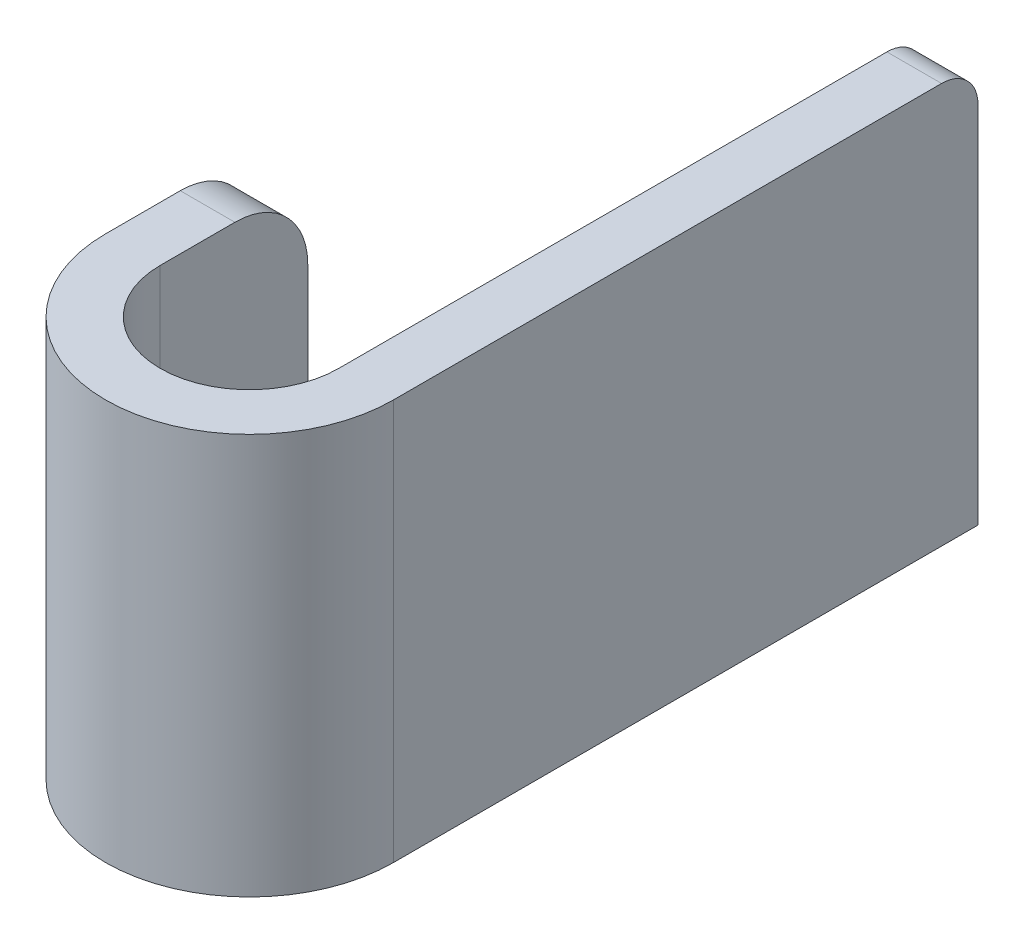
ISO-10303-21;
HEADER;
FILE_DESCRIPTION(('STEP AP214'),'2;1');
FILE_NAME('part.step','',(''),(''),'','','');
FILE_SCHEMA(('AUTOMOTIVE_DESIGN { 1 0 10303 214 1 1 1 1 }'));
ENDSEC;
DATA;
#1=APPLICATION_CONTEXT('core data for automotive mechanical design processes');
#2=APPLICATION_PROTOCOL_DEFINITION('international standard','automotive_design',2000,#1);
#3=PRODUCT_CONTEXT('',#1,'mechanical');
#4=PRODUCT('Part','Part','',(#3));
#5=PRODUCT_RELATED_PRODUCT_CATEGORY('part','',(#4));
#6=PRODUCT_DEFINITION_FORMATION('','',#4);
#7=PRODUCT_DEFINITION_CONTEXT('part definition',#1,'design');
#8=PRODUCT_DEFINITION('design','',#6,#7);
#9=PRODUCT_DEFINITION_SHAPE('','',#8);
#10=(LENGTH_UNIT() NAMED_UNIT(*) SI_UNIT(.MILLI.,.METRE.));
#11=(NAMED_UNIT(*) PLANE_ANGLE_UNIT() SI_UNIT($,.RADIAN.));
#12=(NAMED_UNIT(*) SI_UNIT($,.STERADIAN.) SOLID_ANGLE_UNIT());
#13=UNCERTAINTY_MEASURE_WITH_UNIT(LENGTH_MEASURE(1.E-05),#10,'distance_accuracy_value','');
#14=(GEOMETRIC_REPRESENTATION_CONTEXT(3) GLOBAL_UNCERTAINTY_ASSIGNED_CONTEXT((#13)) GLOBAL_UNIT_ASSIGNED_CONTEXT((#10,
#11,#12)) REPRESENTATION_CONTEXT('',''));
#15=CARTESIAN_POINT('',(0.,0.,0.));
#16=DIRECTION('',(0.,0.,1.));
#17=DIRECTION('',(1.,0.,0.));
#18=AXIS2_PLACEMENT_3D('',#15,#16,#17);
#19=CARTESIAN_POINT('',(0.2,-0.35,1.4));
#20=DIRECTION('',(-1.,0.,0.));
#21=DIRECTION('',(0.,0.,-1.));
#22=AXIS2_PLACEMENT_3D('',#19,#20,#21);
#23=CYLINDRICAL_SURFACE('',#22,0.2);
#24=CARTESIAN_POINT('',(0.2,-0.35,1.4));
#25=DIRECTION('',(-1.,0.,0.));
#26=DIRECTION('',(0.,0.,-1.));
#27=AXIS2_PLACEMENT_3D('',#24,#25,#26);
#28=CIRCLE('',#27,0.2);
#29=CARTESIAN_POINT('',(0.2,-0.35,1.2));
#30=VERTEX_POINT('',#29);
#31=CARTESIAN_POINT('',(0.2,-0.55,1.4));
#32=VERTEX_POINT('',#31);
#33=EDGE_CURVE('E233',#30,#32,#28,.T.);
#34=ORIENTED_EDGE('',*,*,#33,.T.);
#35=DIRECTION('',(-1.,0.,0.));
#36=VECTOR('',#35,1.);
#37=CARTESIAN_POINT('',(0.2,-0.55,1.4));
#38=LINE('',#37,#36);
#39=CARTESIAN_POINT('',(0.05,-0.55,1.4));
#40=VERTEX_POINT('',#39);
#41=EDGE_CURVE('E25',#32,#40,#38,.T.);
#42=ORIENTED_EDGE('',*,*,#41,.T.);
#43=CARTESIAN_POINT('',(0.05,-0.35,1.4));
#44=DIRECTION('',(-1.,0.,0.));
#45=DIRECTION('',(0.,0.,-1.));
#46=AXIS2_PLACEMENT_3D('',#43,#44,#45);
#47=CIRCLE('',#46,0.2);
#48=CARTESIAN_POINT('',(0.05,-0.35,1.2));
#49=VERTEX_POINT('',#48);
#50=EDGE_CURVE('E214',#49,#40,#47,.T.);
#51=ORIENTED_EDGE('',*,*,#50,.F.);
#52=DIRECTION('',(-1.,0.,0.));
#53=VECTOR('',#52,1.);
#54=CARTESIAN_POINT('',(0.2,-0.35,1.2));
#55=LINE('',#54,#53);
#56=EDGE_CURVE('E10',#30,#49,#55,.T.);
#57=ORIENTED_EDGE('',*,*,#56,.F.);
#58=EDGE_LOOP('',(#34,#42,#51,#57));
#59=FACE_BOUND('',#58,.T.);
#60=ADVANCED_FACE('F16',(#59),#23,.T.);
#61=CARTESIAN_POINT('',(0.2,0.55,1.2));
#62=DIRECTION('',(0.,0.,-1.));
#63=DIRECTION('',(0.,-1.,0.));
#64=AXIS2_PLACEMENT_3D('',#61,#62,#63);
#65=PLANE('',#64);
#66=DIRECTION('',(0.,-1.,0.));
#67=VECTOR('',#66,1.);
#68=CARTESIAN_POINT('',(0.2,0.55,1.2));
#69=LINE('',#68,#67);
#70=CARTESIAN_POINT('',(0.2,0.35,1.2));
#71=VERTEX_POINT('',#70);
#72=EDGE_CURVE('E220',#71,#30,#69,.T.);
#73=ORIENTED_EDGE('',*,*,#72,.T.);
#74=ORIENTED_EDGE('',*,*,#56,.T.);
#75=DIRECTION('',(0.,-1.,0.));
#76=VECTOR('',#75,1.);
#77=CARTESIAN_POINT('',(0.05,0.55,1.2));
#78=LINE('',#77,#76);
#79=CARTESIAN_POINT('',(0.05,0.35,1.2));
#80=VERTEX_POINT('',#79);
#81=EDGE_CURVE('E211',#80,#49,#78,.T.);
#82=ORIENTED_EDGE('',*,*,#81,.F.);
#83=DIRECTION('',(-1.,0.,0.));
#84=VECTOR('',#83,1.);
#85=CARTESIAN_POINT('',(0.2,0.35,1.2));
#86=LINE('',#85,#84);
#87=EDGE_CURVE('E133',#71,#80,#86,.T.);
#88=ORIENTED_EDGE('',*,*,#87,.F.);
#89=EDGE_LOOP('',(#73,#74,#82,#88));
#90=FACE_BOUND('',#89,.T.);
#91=ADVANCED_FACE('F18',(#90),#65,.T.);
#92=CARTESIAN_POINT('',(0.568076923077,-0.55,1.177541598874));
#93=DIRECTION('',(0.,1.,0.));
#94=DIRECTION('',(0.,0.,-1.));
#95=AXIS2_PLACEMENT_3D('',#92,#93,#94);
#96=PLANE('',#95);
#97=CARTESIAN_POINT('',(0.445,-0.55,1.605));
#98=DIRECTION('',(0.,-1.,0.));
#99=DIRECTION('',(1.,0.,0.));
#100=AXIS2_PLACEMENT_3D('',#97,#98,#99);
#101=CIRCLE('',#100,0.245);
#102=CARTESIAN_POINT('',(0.69,-0.55,1.605));
#103=VERTEX_POINT('',#102);
#104=CARTESIAN_POINT('',(0.2,-0.55,1.605));
#105=VERTEX_POINT('',#104);
#106=EDGE_CURVE('E138',#103,#105,#101,.T.);
#107=ORIENTED_EDGE('',*,*,#106,.F.);
#108=DIRECTION('',(0.,0.,1.));
#109=VECTOR('',#108,1.);
#110=CARTESIAN_POINT('',(0.69,-0.55,0.));
#111=LINE('',#110,#109);
#112=CARTESIAN_POINT('',(0.69,-0.55,0.));
#113=VERTEX_POINT('',#112);
#114=EDGE_CURVE('E203',#113,#103,#111,.T.);
#115=ORIENTED_EDGE('',*,*,#114,.F.);
#116=DIRECTION('',(-1.,0.,0.));
#117=VECTOR('',#116,1.);
#118=CARTESIAN_POINT('',(0.84,-0.55,0.));
#119=LINE('',#118,#117);
#120=CARTESIAN_POINT('',(0.84,-0.55,0.));
#121=VERTEX_POINT('',#120);
#122=EDGE_CURVE('E174',#121,#113,#119,.T.);
#123=ORIENTED_EDGE('',*,*,#122,.F.);
#124=DIRECTION('',(0.,0.,-1.));
#125=VECTOR('',#124,1.);
#126=CARTESIAN_POINT('',(0.84,-0.55,1.605));
#127=LINE('',#126,#125);
#128=CARTESIAN_POINT('',(0.84,-0.55,1.605));
#129=VERTEX_POINT('',#128);
#130=EDGE_CURVE('E167',#129,#121,#127,.T.);
#131=ORIENTED_EDGE('',*,*,#130,.F.);
#132=CARTESIAN_POINT('',(0.445,-0.55,1.605));
#133=DIRECTION('',(0.,-1.,0.));
#134=DIRECTION('',(1.,0.,0.));
#135=AXIS2_PLACEMENT_3D('',#132,#133,#134);
#136=CIRCLE('',#135,0.395);
#137=CARTESIAN_POINT('',(0.05,-0.55,1.605));
#138=VERTEX_POINT('',#137);
#139=EDGE_CURVE('E191',#129,#138,#136,.T.);
#140=ORIENTED_EDGE('',*,*,#139,.T.);
#141=DIRECTION('',(0.,0.,1.));
#142=VECTOR('',#141,1.);
#143=CARTESIAN_POINT('',(0.05,-0.55,1.2));
#144=LINE('',#143,#142);
#145=EDGE_CURVE('E139',#40,#138,#144,.T.);
#146=ORIENTED_EDGE('',*,*,#145,.F.);
#147=ORIENTED_EDGE('',*,*,#41,.F.);
#148=DIRECTION('',(0.,0.,-1.));
#149=VECTOR('',#148,1.);
#150=CARTESIAN_POINT('',(0.2,-0.55,1.605));
#151=LINE('',#150,#149);
#152=EDGE_CURVE('E224',#105,#32,#151,.T.);
#153=ORIENTED_EDGE('',*,*,#152,.F.);
#154=EDGE_LOOP('',(#107,#115,#123,#131,#140,#146,#147,#153));
#155=FACE_BOUND('',#154,.T.);
#156=ADVANCED_FACE('F243',(#155),#96,.F.);
#157=CARTESIAN_POINT('',(0.84,0.55,0.));
#158=DIRECTION('',(0.,0.,-1.));
#159=DIRECTION('',(0.,-1.,0.));
#160=AXIS2_PLACEMENT_3D('',#157,#158,#159);
#161=PLANE('',#160);
#162=DIRECTION('',(0.,-1.,0.));
#163=VECTOR('',#162,1.);
#164=CARTESIAN_POINT('',(0.84,0.55,0.));
#165=LINE('',#164,#163);
#166=CARTESIAN_POINT('',(0.84,0.45,0.));
#167=VERTEX_POINT('',#166);
#168=EDGE_CURVE('E177',#167,#121,#165,.T.);
#169=ORIENTED_EDGE('',*,*,#168,.T.);
#170=ORIENTED_EDGE('',*,*,#122,.T.);
#171=DIRECTION('',(0.,-1.,0.));
#172=VECTOR('',#171,1.);
#173=CARTESIAN_POINT('',(0.69,0.55,0.));
#174=LINE('',#173,#172);
#175=CARTESIAN_POINT('',(0.69,0.45,0.));
#176=VERTEX_POINT('',#175);
#177=EDGE_CURVE('E199',#176,#113,#174,.T.);
#178=ORIENTED_EDGE('',*,*,#177,.F.);
#179=DIRECTION('',(-1.,0.,0.));
#180=VECTOR('',#179,1.);
#181=CARTESIAN_POINT('',(0.84,0.45,0.));
#182=LINE('',#181,#180);
#183=EDGE_CURVE('E170',#167,#176,#182,.T.);
#184=ORIENTED_EDGE('',*,*,#183,.F.);
#185=EDGE_LOOP('',(#169,#170,#178,#184));
#186=FACE_BOUND('',#185,.T.);
#187=ADVANCED_FACE('F239',(#186),#161,.T.);
#188=CARTESIAN_POINT('',(0.2,0.55,1.605));
#189=DIRECTION('',(1.,0.,0.));
#190=DIRECTION('',(0.,1.,0.));
#191=AXIS2_PLACEMENT_3D('',#188,#189,#190);
#192=PLANE('',#191);
#193=ORIENTED_EDGE('',*,*,#72,.F.);
#194=CARTESIAN_POINT('',(0.2,0.35,1.4));
#195=DIRECTION('',(1.,0.,0.));
#196=DIRECTION('',(0.,0.,-1.));
#197=AXIS2_PLACEMENT_3D('',#194,#195,#196);
#198=CIRCLE('',#197,0.2);
#199=CARTESIAN_POINT('',(0.2,0.55,1.4));
#200=VERTEX_POINT('',#199);
#201=EDGE_CURVE('E194',#71,#200,#198,.T.);
#202=ORIENTED_EDGE('',*,*,#201,.T.);
#203=DIRECTION('',(0.,0.,-1.));
#204=VECTOR('',#203,1.);
#205=CARTESIAN_POINT('',(0.2,0.55,1.605));
#206=LINE('',#205,#204);
#207=CARTESIAN_POINT('',(0.2,0.55,1.605));
#208=VERTEX_POINT('',#207);
#209=EDGE_CURVE('E156',#208,#200,#206,.T.);
#210=ORIENTED_EDGE('',*,*,#209,.F.);
#211=DIRECTION('',(0.,-1.,0.));
#212=VECTOR('',#211,1.);
#213=CARTESIAN_POINT('',(0.2,0.55,1.605));
#214=LINE('',#213,#212);
#215=EDGE_CURVE('E195',#208,#105,#214,.T.);
#216=ORIENTED_EDGE('',*,*,#215,.T.);
#217=ORIENTED_EDGE('',*,*,#152,.T.);
#218=ORIENTED_EDGE('',*,*,#33,.F.);
#219=EDGE_LOOP('',(#193,#202,#210,#216,#217,#218));
#220=FACE_BOUND('',#219,.T.);
#221=ADVANCED_FACE('F285',(#220),#192,.T.);
#222=CARTESIAN_POINT('',(0.2,0.35,1.4));
#223=DIRECTION('',(-1.,0.,0.));
#224=DIRECTION('',(0.,0.,-1.));
#225=AXIS2_PLACEMENT_3D('',#222,#223,#224);
#226=CYLINDRICAL_SURFACE('',#225,0.2);
#227=ORIENTED_EDGE('',*,*,#87,.T.);
#228=CARTESIAN_POINT('',(0.05,0.35,1.4));
#229=DIRECTION('',(1.,0.,0.));
#230=DIRECTION('',(0.,0.,-1.));
#231=AXIS2_PLACEMENT_3D('',#228,#229,#230);
#232=CIRCLE('',#231,0.2);
#233=CARTESIAN_POINT('',(0.05,0.55,1.4));
#234=VERTEX_POINT('',#233);
#235=EDGE_CURVE('E125',#80,#234,#232,.T.);
#236=ORIENTED_EDGE('',*,*,#235,.T.);
#237=DIRECTION('',(-1.,0.,0.));
#238=VECTOR('',#237,1.);
#239=CARTESIAN_POINT('',(0.2,0.55,1.4));
#240=LINE('',#239,#238);
#241=EDGE_CURVE('E130',#200,#234,#240,.T.);
#242=ORIENTED_EDGE('',*,*,#241,.F.);
#243=ORIENTED_EDGE('',*,*,#201,.F.);
#244=EDGE_LOOP('',(#227,#236,#242,#243));
#245=FACE_BOUND('',#244,.T.);
#246=ADVANCED_FACE('F127',(#245),#226,.T.);
#247=CARTESIAN_POINT('',(0.445,0.55,1.605));
#248=DIRECTION('',(0.,1.,0.));
#249=DIRECTION('',(1.,0.,0.));
#250=AXIS2_PLACEMENT_3D('',#247,#248,#249);
#251=CYLINDRICAL_SURFACE('',#250,0.245);
#252=DIRECTION('',(0.,-1.,0.));
#253=VECTOR('',#252,1.);
#254=CARTESIAN_POINT('',(0.69,0.55,1.605));
#255=LINE('',#254,#253);
#256=CARTESIAN_POINT('',(0.69,0.55,1.605));
#257=VERTEX_POINT('',#256);
#258=EDGE_CURVE('E207',#257,#103,#255,.T.);
#259=ORIENTED_EDGE('',*,*,#258,.T.);
#260=ORIENTED_EDGE('',*,*,#106,.T.);
#261=ORIENTED_EDGE('',*,*,#215,.F.);
#262=CARTESIAN_POINT('',(0.445,0.55,1.605));
#263=DIRECTION('',(0.,-1.,0.));
#264=DIRECTION('',(1.,0.,0.));
#265=AXIS2_PLACEMENT_3D('',#262,#263,#264);
#266=CIRCLE('',#265,0.245);
#267=EDGE_CURVE('E163',#257,#208,#266,.T.);
#268=ORIENTED_EDGE('',*,*,#267,.F.);
#269=EDGE_LOOP('',(#259,#260,#261,#268));
#270=FACE_BOUND('',#269,.T.);
#271=ADVANCED_FACE('F288',(#270),#251,.F.);
#272=CARTESIAN_POINT('',(0.05,0.55,1.2));
#273=DIRECTION('',(-1.,0.,0.));
#274=DIRECTION('',(0.,0.,1.));
#275=AXIS2_PLACEMENT_3D('',#272,#273,#274);
#276=PLANE('',#275);
#277=ORIENTED_EDGE('',*,*,#81,.T.);
#278=ORIENTED_EDGE('',*,*,#50,.T.);
#279=ORIENTED_EDGE('',*,*,#145,.T.);
#280=DIRECTION('',(0.,-1.,0.));
#281=VECTOR('',#280,1.);
#282=CARTESIAN_POINT('',(0.05,0.55,1.605));
#283=LINE('',#282,#281);
#284=CARTESIAN_POINT('',(0.05,0.55,1.605));
#285=VERTEX_POINT('',#284);
#286=EDGE_CURVE('E145',#285,#138,#283,.T.);
#287=ORIENTED_EDGE('',*,*,#286,.F.);
#288=DIRECTION('',(0.,0.,1.));
#289=VECTOR('',#288,1.);
#290=CARTESIAN_POINT('',(0.05,0.55,1.2));
#291=LINE('',#290,#289);
#292=EDGE_CURVE('E142',#234,#285,#291,.T.);
#293=ORIENTED_EDGE('',*,*,#292,.F.);
#294=ORIENTED_EDGE('',*,*,#235,.F.);
#295=EDGE_LOOP('',(#277,#278,#279,#287,#293,#294));
#296=FACE_BOUND('',#295,.T.);
#297=ADVANCED_FACE('F143',(#296),#276,.T.);
#298=CARTESIAN_POINT('',(0.69,0.55,0.));
#299=DIRECTION('',(-1.,0.,0.));
#300=DIRECTION('',(0.,1.,0.));
#301=AXIS2_PLACEMENT_3D('',#298,#299,#300);
#302=PLANE('',#301);
#303=ORIENTED_EDGE('',*,*,#177,.T.);
#304=ORIENTED_EDGE('',*,*,#114,.T.);
#305=ORIENTED_EDGE('',*,*,#258,.F.);
#306=DIRECTION('',(0.,0.,1.));
#307=VECTOR('',#306,1.);
#308=CARTESIAN_POINT('',(0.69,0.55,0.));
#309=LINE('',#308,#307);
#310=CARTESIAN_POINT('',(0.69,0.55,0.1));
#311=VERTEX_POINT('',#310);
#312=EDGE_CURVE('E248',#311,#257,#309,.T.);
#313=ORIENTED_EDGE('',*,*,#312,.F.);
#314=CARTESIAN_POINT('',(0.69,0.45,0.1));
#315=DIRECTION('',(-1.,0.,0.));
#316=DIRECTION('',(0.,0.,-1.));
#317=AXIS2_PLACEMENT_3D('',#314,#315,#316);
#318=CIRCLE('',#317,0.1);
#319=EDGE_CURVE('E168',#311,#176,#318,.T.);
#320=ORIENTED_EDGE('',*,*,#319,.T.);
#321=EDGE_LOOP('',(#303,#304,#305,#313,#320));
#322=FACE_BOUND('',#321,.T.);
#323=ADVANCED_FACE('F245',(#322),#302,.T.);
#324=CARTESIAN_POINT('',(0.445,0.55,1.605));
#325=DIRECTION('',(0.,1.,0.));
#326=DIRECTION('',(1.,0.,0.));
#327=AXIS2_PLACEMENT_3D('',#324,#325,#326);
#328=CYLINDRICAL_SURFACE('',#327,0.395);
#329=CARTESIAN_POINT('',(0.445,0.55,1.605));
#330=DIRECTION('',(0.,-1.,0.));
#331=DIRECTION('',(1.,0.,0.));
#332=AXIS2_PLACEMENT_3D('',#329,#330,#331);
#333=CIRCLE('',#332,0.395);
#334=CARTESIAN_POINT('',(0.84,0.55,1.605));
#335=VERTEX_POINT('',#334);
#336=EDGE_CURVE('E150',#335,#285,#333,.T.);
#337=ORIENTED_EDGE('',*,*,#336,.T.);
#338=ORIENTED_EDGE('',*,*,#286,.T.);
#339=ORIENTED_EDGE('',*,*,#139,.F.);
#340=DIRECTION('',(0.,-1.,0.));
#341=VECTOR('',#340,1.);
#342=CARTESIAN_POINT('',(0.84,0.55,1.605));
#343=LINE('',#342,#341);
#344=EDGE_CURVE('E185',#335,#129,#343,.T.);
#345=ORIENTED_EDGE('',*,*,#344,.F.);
#346=EDGE_LOOP('',(#337,#338,#339,#345));
#347=FACE_BOUND('',#346,.T.);
#348=ADVANCED_FACE('F283',(#347),#328,.T.);
#349=CARTESIAN_POINT('',(0.84,0.45,0.1));
#350=DIRECTION('',(-1.,0.,0.));
#351=DIRECTION('',(0.,1.,0.));
#352=AXIS2_PLACEMENT_3D('',#349,#350,#351);
#353=CYLINDRICAL_SURFACE('',#352,0.1);
#354=CARTESIAN_POINT('',(0.84,0.45,0.1));
#355=DIRECTION('',(-1.,0.,0.));
#356=DIRECTION('',(0.,0.,-1.));
#357=AXIS2_PLACEMENT_3D('',#354,#355,#356);
#358=CIRCLE('',#357,0.1);
#359=CARTESIAN_POINT('',(0.84,0.55,0.1));
#360=VERTEX_POINT('',#359);
#361=EDGE_CURVE('E184',#360,#167,#358,.T.);
#362=ORIENTED_EDGE('',*,*,#361,.T.);
#363=ORIENTED_EDGE('',*,*,#183,.T.);
#364=ORIENTED_EDGE('',*,*,#319,.F.);
#365=DIRECTION('',(-1.,0.,0.));
#366=VECTOR('',#365,1.);
#367=CARTESIAN_POINT('',(0.84,0.55,0.1));
#368=LINE('',#367,#366);
#369=EDGE_CURVE('E254',#360,#311,#368,.T.);
#370=ORIENTED_EDGE('',*,*,#369,.F.);
#371=EDGE_LOOP('',(#362,#363,#364,#370));
#372=FACE_BOUND('',#371,.T.);
#373=ADVANCED_FACE('F253',(#372),#353,.T.);
#374=CARTESIAN_POINT('',(0.84,0.55,1.605));
#375=DIRECTION('',(1.,0.,0.));
#376=DIRECTION('',(0.,0.,-1.));
#377=AXIS2_PLACEMENT_3D('',#374,#375,#376);
#378=PLANE('',#377);
#379=ORIENTED_EDGE('',*,*,#168,.F.);
#380=ORIENTED_EDGE('',*,*,#361,.F.);
#381=DIRECTION('',(0.,0.,-1.));
#382=VECTOR('',#381,1.);
#383=CARTESIAN_POINT('',(0.84,0.55,1.605));
#384=LINE('',#383,#382);
#385=EDGE_CURVE('E275',#335,#360,#384,.T.);
#386=ORIENTED_EDGE('',*,*,#385,.F.);
#387=ORIENTED_EDGE('',*,*,#344,.T.);
#388=ORIENTED_EDGE('',*,*,#130,.T.);
#389=EDGE_LOOP('',(#379,#380,#386,#387,#388));
#390=FACE_BOUND('',#389,.T.);
#391=ADVANCED_FACE('F259',(#390),#378,.T.);
#392=CARTESIAN_POINT('',(0.568076923077,0.55,1.177541598874));
#393=DIRECTION('',(0.,1.,0.));
#394=DIRECTION('',(0.,0.,-1.));
#395=AXIS2_PLACEMENT_3D('',#392,#393,#394);
#396=PLANE('',#395);
#397=ORIENTED_EDGE('',*,*,#385,.T.);
#398=ORIENTED_EDGE('',*,*,#369,.T.);
#399=ORIENTED_EDGE('',*,*,#312,.T.);
#400=ORIENTED_EDGE('',*,*,#267,.T.);
#401=ORIENTED_EDGE('',*,*,#209,.T.);
#402=ORIENTED_EDGE('',*,*,#241,.T.);
#403=ORIENTED_EDGE('',*,*,#292,.T.);
#404=ORIENTED_EDGE('',*,*,#336,.F.);
#405=EDGE_LOOP('',(#397,#398,#399,#400,#401,#402,#403,#404));
#406=FACE_BOUND('',#405,.T.);
#407=ADVANCED_FACE('F153',(#406),#396,.T.);
#408=CLOSED_SHELL('',(#60,#91,#156,#187,#221,#246,#271,#297,#323,#348,#373,#391,#407));
#409=MANIFOLD_SOLID_BREP('B1',#408);
#410=ADVANCED_BREP_SHAPE_REPRESENTATION('',(#18,#409),#14);
#411=SHAPE_DEFINITION_REPRESENTATION(#9,#410);
ENDSEC;
END-ISO-10303-21;
